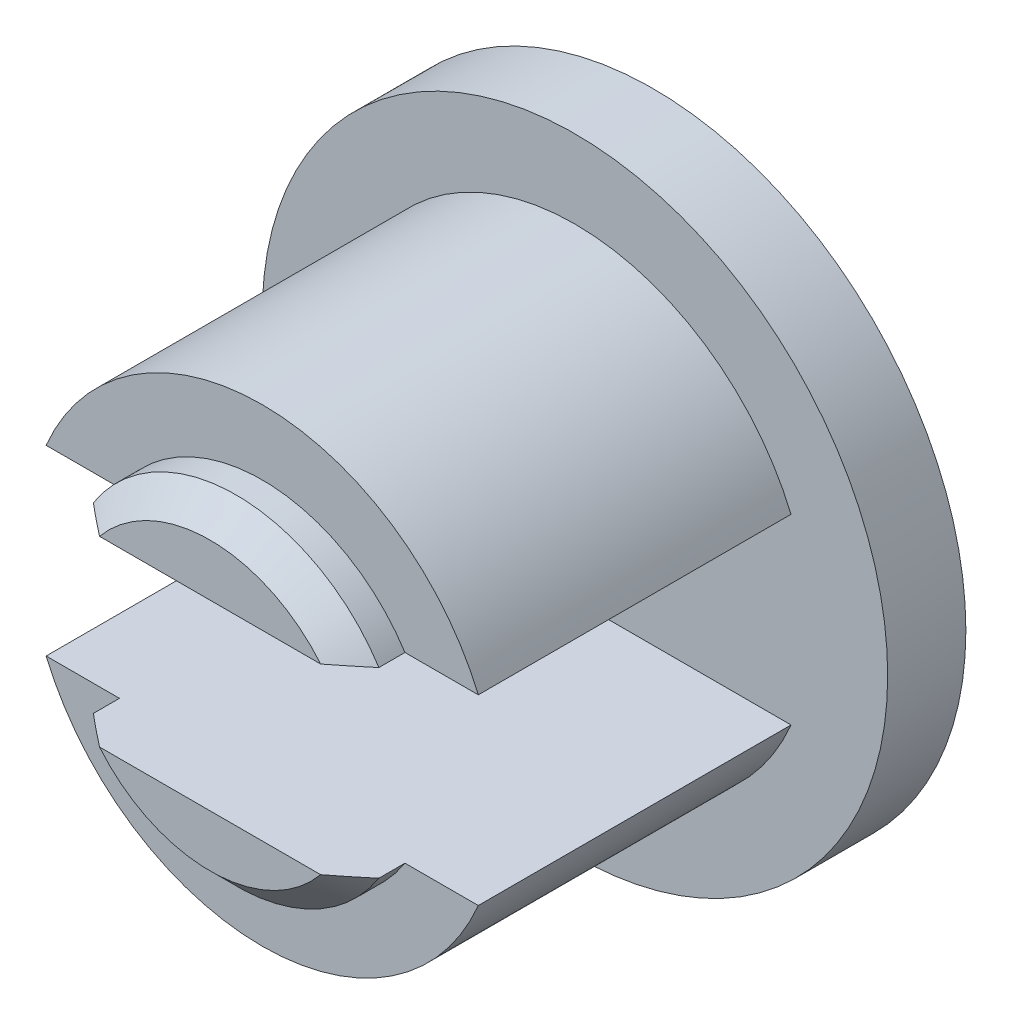
ISO-10303-21;
HEADER;
FILE_DESCRIPTION(('STEP AP214'),'2;1');
FILE_NAME('part.step','',(''),(''),'','','');
FILE_SCHEMA(('AUTOMOTIVE_DESIGN { 1 0 10303 214 1 1 1 1 }'));
ENDSEC;
DATA;
#1=APPLICATION_CONTEXT('core data for automotive mechanical design processes');
#2=APPLICATION_PROTOCOL_DEFINITION('international standard','automotive_design',2000,#1);
#3=PRODUCT_CONTEXT('',#1,'mechanical');
#4=PRODUCT('Part','Part','',(#3));
#5=PRODUCT_RELATED_PRODUCT_CATEGORY('part','',(#4));
#6=PRODUCT_DEFINITION_FORMATION('','',#4);
#7=PRODUCT_DEFINITION_CONTEXT('part definition',#1,'design');
#8=PRODUCT_DEFINITION('design','',#6,#7);
#9=PRODUCT_DEFINITION_SHAPE('','',#8);
#10=(LENGTH_UNIT() NAMED_UNIT(*) SI_UNIT(.MILLI.,.METRE.));
#11=(NAMED_UNIT(*) PLANE_ANGLE_UNIT() SI_UNIT($,.RADIAN.));
#12=(NAMED_UNIT(*) SI_UNIT($,.STERADIAN.) SOLID_ANGLE_UNIT());
#13=UNCERTAINTY_MEASURE_WITH_UNIT(LENGTH_MEASURE(1.E-05),#10,'distance_accuracy_value','');
#14=(GEOMETRIC_REPRESENTATION_CONTEXT(3) GLOBAL_UNCERTAINTY_ASSIGNED_CONTEXT((#13)) GLOBAL_UNIT_ASSIGNED_CONTEXT((#10,
#11,#12)) REPRESENTATION_CONTEXT('',''));
#15=CARTESIAN_POINT('',(0.,0.,0.));
#16=DIRECTION('',(0.,0.,1.));
#17=DIRECTION('',(1.,0.,0.));
#18=AXIS2_PLACEMENT_3D('',#15,#16,#17);
#19=CARTESIAN_POINT('',(0.,0.,9.));
#20=DIRECTION('',(0.,0.,-1.));
#21=DIRECTION('',(-1.,0.,0.));
#22=AXIS2_PLACEMENT_3D('',#19,#20,#21);
#23=CYLINDRICAL_SURFACE('',#22,4.5);
#24=CARTESIAN_POINT('',(0.,0.,9.));
#25=DIRECTION('',(0.,0.,1.));
#26=DIRECTION('',(1.,0.,0.));
#27=AXIS2_PLACEMENT_3D('',#24,#25,#26);
#28=CIRCLE('',#27,4.5);
#29=CARTESIAN_POINT('',(4.14578098794425,1.75,9.));
#30=VERTEX_POINT('',#29);
#31=CARTESIAN_POINT('',(-4.14578098794425,1.75,9.));
#32=VERTEX_POINT('',#31);
#33=EDGE_CURVE('E229',#30,#32,#28,.T.);
#34=ORIENTED_EDGE('',*,*,#33,.F.);
#35=DIRECTION('',(0.,0.,-1.));
#36=VECTOR('',#35,1.);
#37=CARTESIAN_POINT('',(4.14578098794425,1.75,9.));
#38=LINE('',#37,#36);
#39=CARTESIAN_POINT('',(4.14578098794425,1.75,3.));
#40=VERTEX_POINT('',#39);
#41=EDGE_CURVE('E78',#30,#40,#38,.T.);
#42=ORIENTED_EDGE('',*,*,#41,.T.);
#43=CARTESIAN_POINT('',(0.,0.,3.));
#44=DIRECTION('',(0.,0.,1.));
#45=DIRECTION('',(1.,0.,0.));
#46=AXIS2_PLACEMENT_3D('',#43,#44,#45);
#47=CIRCLE('',#46,4.5);
#48=CARTESIAN_POINT('',(-4.14578098794425,1.75,3.));
#49=VERTEX_POINT('',#48);
#50=EDGE_CURVE('E248',#40,#49,#47,.T.);
#51=ORIENTED_EDGE('',*,*,#50,.T.);
#52=DIRECTION('',(0.,0.,-1.));
#53=VECTOR('',#52,1.);
#54=CARTESIAN_POINT('',(-4.14578098794425,1.75,9.));
#55=LINE('',#54,#53);
#56=EDGE_CURVE('E232',#49,#32,#55,.F.);
#57=ORIENTED_EDGE('',*,*,#56,.T.);
#58=EDGE_LOOP('',(#34,#42,#51,#57));
#59=FACE_BOUND('',#58,.T.);
#60=ADVANCED_FACE('F47',(#59),#23,.T.);
#61=CARTESIAN_POINT('',(0.,0.,9.));
#62=DIRECTION('',(0.,0.,1.));
#63=DIRECTION('',(1.,0.,0.));
#64=AXIS2_PLACEMENT_3D('',#61,#62,#63);
#65=PLANE('',#64);
#66=DIRECTION('',(-1.,0.,0.));
#67=VECTOR('',#66,1.);
#68=CARTESIAN_POINT('',(0.,1.75,9.));
#69=LINE('',#68,#67);
#70=CARTESIAN_POINT('',(2.73861278752583,1.75,9.));
#71=VERTEX_POINT('',#70);
#72=EDGE_CURVE('E301',#30,#71,#69,.T.);
#73=ORIENTED_EDGE('',*,*,#72,.F.);
#74=ORIENTED_EDGE('',*,*,#33,.T.);
#75=CARTESIAN_POINT('',(-2.73861278752583,1.75,9.));
#76=VERTEX_POINT('',#75);
#77=EDGE_CURVE('E298',#76,#32,#69,.T.);
#78=ORIENTED_EDGE('',*,*,#77,.F.);
#79=CARTESIAN_POINT('',(0.,0.,9.));
#80=DIRECTION('',(0.,0.,1.));
#81=DIRECTION('',(1.,0.,0.));
#82=AXIS2_PLACEMENT_3D('',#79,#80,#81);
#83=CIRCLE('',#82,3.25);
#84=EDGE_CURVE('E246',#71,#76,#83,.T.);
#85=ORIENTED_EDGE('',*,*,#84,.F.);
#86=EDGE_LOOP('',(#73,#74,#78,#85));
#87=FACE_BOUND('',#86,.T.);
#88=ADVANCED_FACE('F186',(#87),#65,.T.);
#89=CARTESIAN_POINT('',(0.,0.,10.));
#90=DIRECTION('',(0.,0.,-1.));
#91=DIRECTION('',(-1.,0.,0.));
#92=AXIS2_PLACEMENT_3D('',#89,#90,#91);
#93=CYLINDRICAL_SURFACE('',#92,3.25);
#94=CARTESIAN_POINT('',(0.,0.,9.5));
#95=DIRECTION('',(0.,0.,1.));
#96=DIRECTION('',(1.,0.,0.));
#97=AXIS2_PLACEMENT_3D('',#94,#95,#96);
#98=CIRCLE('',#97,3.25);
#99=CARTESIAN_POINT('',(-2.73861278752583,1.75,9.5));
#100=VERTEX_POINT('',#99);
#101=CARTESIAN_POINT('',(2.73861278752583,1.75,9.5));
#102=VERTEX_POINT('',#101);
#103=EDGE_CURVE('E153',#100,#102,#98,.F.);
#104=ORIENTED_EDGE('',*,*,#103,.T.);
#105=DIRECTION('',(0.,0.,-1.));
#106=VECTOR('',#105,1.);
#107=CARTESIAN_POINT('',(2.73861278752583,1.75,10.));
#108=LINE('',#107,#106);
#109=EDGE_CURVE('E304',#102,#71,#108,.T.);
#110=ORIENTED_EDGE('',*,*,#109,.T.);
#111=ORIENTED_EDGE('',*,*,#84,.T.);
#112=DIRECTION('',(0.,0.,-1.));
#113=VECTOR('',#112,1.);
#114=CARTESIAN_POINT('',(-2.73861278752583,1.75,10.));
#115=LINE('',#114,#113);
#116=EDGE_CURVE('E292',#76,#100,#115,.F.);
#117=ORIENTED_EDGE('',*,*,#116,.T.);
#118=EDGE_LOOP('',(#104,#110,#111,#117));
#119=FACE_BOUND('',#118,.T.);
#120=ADVANCED_FACE('F181',(#119),#93,.T.);
#121=CARTESIAN_POINT('',(0.,0.,10.));
#122=DIRECTION('',(0.,0.,1.));
#123=DIRECTION('',(1.,0.,0.));
#124=AXIS2_PLACEMENT_3D('',#121,#122,#123);
#125=PLANE('',#124);
#126=DIRECTION('',(-1.,0.,0.));
#127=VECTOR('',#126,1.);
#128=CARTESIAN_POINT('',(17.72,1.75,10.));
#129=LINE('',#128,#127);
#130=CARTESIAN_POINT('',(2.12132034355964,1.75,10.));
#131=VERTEX_POINT('',#130);
#132=CARTESIAN_POINT('',(-2.12132034355964,1.75,10.));
#133=VERTEX_POINT('',#132);
#134=EDGE_CURVE('E144',#131,#133,#129,.T.);
#135=ORIENTED_EDGE('',*,*,#134,.F.);
#136=CARTESIAN_POINT('',(0.,0.,10.));
#137=DIRECTION('',(0.,0.,1.));
#138=DIRECTION('',(1.,0.,0.));
#139=AXIS2_PLACEMENT_3D('',#136,#137,#138);
#140=CIRCLE('',#139,2.75);
#141=EDGE_CURVE('E147',#131,#133,#140,.T.);
#142=ORIENTED_EDGE('',*,*,#141,.T.);
#143=EDGE_LOOP('',(#135,#142));
#144=FACE_BOUND('',#143,.T.);
#145=ADVANCED_FACE('F176',(#144),#125,.T.);
#146=CARTESIAN_POINT('',(0.,0.,10.));
#147=DIRECTION('',(0.,0.,-1.));
#148=DIRECTION('',(-1.,0.,0.));
#149=AXIS2_PLACEMENT_3D('',#146,#147,#148);
#150=CONICAL_SURFACE('',#149,2.75,0.785398163397447);
#151=CARTESIAN_POINT('',(2.73944346355251,1.75,9.49929999999991));
#152=CARTESIAN_POINT('',(2.65443009145347,1.75,9.57090762624135));
#153=CARTESIAN_POINT('',(2.56896713198327,1.75,9.64199508380564));
#154=CARTESIAN_POINT('',(2.39679009304747,1.75,9.78274815272182));
#155=CARTESIAN_POINT('',(2.31007525755715,1.75,9.85241283779644));
#156=CARTESIAN_POINT('',(2.13170023880289,1.75,9.99255703970262));
#157=CARTESIAN_POINT('',(2.03997988332316,1.75,10.0629603632436));
#158=CARTESIAN_POINT('',(1.8544659964091,1.75,10.2009429312913));
#159=CARTESIAN_POINT('',(1.76067305769593,1.75,10.2685229676268));
#160=CARTESIAN_POINT('',(1.57006002813852,1.75,10.3999366170817));
#161=CARTESIAN_POINT('',(1.47323172857247,1.75,10.4637584308617));
#162=CARTESIAN_POINT('',(1.27584645205723,1.75,10.5856875811883));
#163=CARTESIAN_POINT('',(1.17528584144719,1.75,10.6437891364416));
#164=CARTESIAN_POINT('',(0.971221072466855,1.75,10.7504234179393));
#165=CARTESIAN_POINT('',(0.867792170791659,1.75,10.799097367063));
#166=CARTESIAN_POINT('',(0.65585794408432,1.75,10.8836380088129));
#167=CARTESIAN_POINT('',(0.547366652604175,1.75,10.9195379744857));
#168=CARTESIAN_POINT('',(0.380720528488747,1.75,10.9598901970268));
#169=CARTESIAN_POINT('',(0.324199153070993,1.75,10.971115043409));
#170=CARTESIAN_POINT('',(0.210348382213359,1.75,10.9883001086163));
#171=CARTESIAN_POINT('',(0.153019082163456,1.75,10.9942609437483));
#172=CARTESIAN_POINT('',(0.0381857249401158,1.75,11.0005201961443));
#173=CARTESIAN_POINT('',(-0.019317582680136,1.75,11.0008321678665));
#174=CARTESIAN_POINT('',(-0.134077315147715,1.75,10.9958080169729));
#175=CARTESIAN_POINT('',(-0.191333719210587,1.75,10.990471427831));
#176=CARTESIAN_POINT('',(-0.304409470889937,1.75,10.9745942105262));
#177=CARTESIAN_POINT('',(-0.360237813595879,1.75,10.9641164274349));
#178=CARTESIAN_POINT('',(-0.4708234257944,1.75,10.9385702997388));
#179=CARTESIAN_POINT('',(-0.525580586499461,1.75,10.9235014914262));
#180=CARTESIAN_POINT('',(-0.634526526337474,1.75,10.8892436984579));
#181=CARTESIAN_POINT('',(-0.688699689186651,1.75,10.8700056517481));
#182=CARTESIAN_POINT('',(-0.79572337652592,1.75,10.828216891939));
#183=CARTESIAN_POINT('',(-0.848574186073777,1.75,10.8056669001182));
#184=CARTESIAN_POINT('',(-0.989127502469045,1.75,10.7413463646168));
#185=CARTESIAN_POINT('',(-1.07567632429651,1.75,10.6970619095105));
#186=CARTESIAN_POINT('',(-1.2457835950047,1.75,10.6030361685048));
#187=CARTESIAN_POINT('',(-1.3293394713507,1.75,10.5532903308824));
#188=CARTESIAN_POINT('',(-1.49434285860387,1.75,10.4496904494003));
#189=CARTESIAN_POINT('',(-1.57577983533948,1.75,10.3958197600892));
#190=CARTESIAN_POINT('',(-1.7366492577234,1.75,10.2852398487706));
#191=CARTESIAN_POINT('',(-1.81608233719687,1.75,10.2285315416611));
#192=CARTESIAN_POINT('',(-1.96756820532194,1.75,10.11724735033));
#193=CARTESIAN_POINT('',(-2.03973293491802,1.75,10.0628230909722));
#194=CARTESIAN_POINT('',(-2.18296849864286,1.75,9.95254315676739));
#195=CARTESIAN_POINT('',(-2.25403922481133,1.75,9.89668734208043));
#196=CARTESIAN_POINT('',(-2.39458600153216,1.75,9.78440241577386));
#197=CARTESIAN_POINT('',(-2.46407085462611,1.75,9.72798428977876));
#198=CARTESIAN_POINT('',(-2.60228418189618,1.75,9.61426016620873));
#199=CARTESIAN_POINT('',(-2.67101282551596,1.75,9.55695437475958));
#200=CARTESIAN_POINT('',(-2.73944346355251,1.75,9.49929999999991));
#201=B_SPLINE_CURVE_WITH_KNOTS('',3,(#151,#152,#153,#154,#155,#156,#157,#158,#159,#160,#161,
#162,#163,#164,#165,#166,#167,#168,#169,#170,#171,#172,#173,#174,#175,#176,#177,#178,#179,#180,
#181,#182,#183,#184,#185,#186,#187,#188,#189,#190,#191,#192,#193,#194,#195,#196,#197,#198,#199,
#200),.UNSPECIFIED.,.F.,.F.,(4,2,2,2,2,2,2,2,2,2,2,2,2,2,2,2,2,2,2,2,2,2,2,2,4),(0.,
0.333469080293946,0.667148753430491,1.01398632076862,1.36072595070936,1.70850177756413,
2.05662555848843,2.39904369445119,2.74056327219607,2.91322880203948,3.08587411363456,
3.25810510743988,3.43035032726062,3.60054061778064,3.77074810374958,3.94307928936489,
4.11537300002441,4.40672595280236,4.69832360049107,4.99116719519776,5.28391697280489,
5.55505528140701,5.82622017758483,6.09472718277802,6.36317274554218),.UNSPECIFIED.);
#202=EDGE_CURVE('E11',#102,#131,#201,.T.);
#203=ORIENTED_EDGE('',*,*,#202,.F.);
#204=ORIENTED_EDGE('',*,*,#103,.F.);
#205=EDGE_CURVE('E53',#133,#100,#201,.T.);
#206=ORIENTED_EDGE('',*,*,#205,.F.);
#207=ORIENTED_EDGE('',*,*,#141,.F.);
#208=EDGE_LOOP('',(#203,#204,#206,#207));
#209=FACE_BOUND('',#208,.T.);
#210=ADVANCED_FACE('F208',(#209),#150,.T.);
#211=CARTESIAN_POINT('',(0.,0.,1.5));
#212=DIRECTION('',(0.,0.,-1.));
#213=DIRECTION('',(-1.,0.,0.));
#214=AXIS2_PLACEMENT_3D('',#211,#212,#213);
#215=CYLINDRICAL_SURFACE('',#214,2.5);
#216=CARTESIAN_POINT('',(0.,0.,0.5));
#217=DIRECTION('',(0.,0.,1.));
#218=DIRECTION('',(1.,0.,0.));
#219=AXIS2_PLACEMENT_3D('',#216,#217,#218);
#220=CIRCLE('',#219,2.5);
#221=CARTESIAN_POINT('',(2.5,0.,0.5));
#222=VERTEX_POINT('',#221);
#223=EDGE_CURVE('E155',#222,#222,#220,.T.);
#224=ORIENTED_EDGE('',*,*,#223,.T.);
#225=EDGE_LOOP('',(#224));
#226=FACE_BOUND('',#225,.T.);
#227=CARTESIAN_POINT('',(0.,0.,1.5));
#228=DIRECTION('',(0.,0.,1.));
#229=DIRECTION('',(1.,0.,0.));
#230=AXIS2_PLACEMENT_3D('',#227,#228,#229);
#231=CIRCLE('',#230,2.5);
#232=CARTESIAN_POINT('',(2.5,0.,1.5));
#233=VERTEX_POINT('',#232);
#234=EDGE_CURVE('E255',#233,#233,#231,.T.);
#235=ORIENTED_EDGE('',*,*,#234,.F.);
#236=EDGE_LOOP('',(#235));
#237=FACE_BOUND('',#236,.T.);
#238=ADVANCED_FACE('F205',(#226,#237),#215,.T.);
#239=CARTESIAN_POINT('',(0.,0.,0.));
#240=DIRECTION('',(0.,0.,1.));
#241=DIRECTION('',(1.,0.,0.));
#242=AXIS2_PLACEMENT_3D('',#239,#240,#241);
#243=PLANE('',#242);
#244=CARTESIAN_POINT('',(0.,0.,0.));
#245=DIRECTION('',(0.,0.,1.));
#246=DIRECTION('',(1.,0.,0.));
#247=AXIS2_PLACEMENT_3D('',#244,#245,#246);
#248=CIRCLE('',#247,2.);
#249=CARTESIAN_POINT('',(2.,0.,0.));
#250=VERTEX_POINT('',#249);
#251=EDGE_CURVE('E148',#250,#250,#248,.F.);
#252=ORIENTED_EDGE('',*,*,#251,.T.);
#253=EDGE_LOOP('',(#252));
#254=FACE_BOUND('',#253,.T.);
#255=ADVANCED_FACE('F201',(#254),#243,.F.);
#256=CARTESIAN_POINT('',(0.,0.,3.));
#257=DIRECTION('',(0.,0.,-1.));
#258=DIRECTION('',(-1.,0.,0.));
#259=AXIS2_PLACEMENT_3D('',#256,#257,#258);
#260=CYLINDRICAL_SURFACE('',#259,6.);
#261=CARTESIAN_POINT('',(0.,0.,3.));
#262=DIRECTION('',(0.,0.,1.));
#263=DIRECTION('',(1.,0.,0.));
#264=AXIS2_PLACEMENT_3D('',#261,#262,#263);
#265=CIRCLE('',#264,6.);
#266=CARTESIAN_POINT('',(6.,0.,3.));
#267=VERTEX_POINT('',#266);
#268=EDGE_CURVE('E241',#267,#267,#265,.T.);
#269=ORIENTED_EDGE('',*,*,#268,.F.);
#270=EDGE_LOOP('',(#269));
#271=FACE_BOUND('',#270,.T.);
#272=CARTESIAN_POINT('',(0.,0.,1.5));
#273=DIRECTION('',(0.,0.,1.));
#274=DIRECTION('',(1.,0.,0.));
#275=AXIS2_PLACEMENT_3D('',#272,#273,#274);
#276=CIRCLE('',#275,6.);
#277=CARTESIAN_POINT('',(6.,0.,1.5));
#278=VERTEX_POINT('',#277);
#279=EDGE_CURVE('E235',#278,#278,#276,.T.);
#280=ORIENTED_EDGE('',*,*,#279,.T.);
#281=EDGE_LOOP('',(#280));
#282=FACE_BOUND('',#281,.T.);
#283=ADVANCED_FACE('F194',(#271,#282),#260,.T.);
#284=CARTESIAN_POINT('',(0.,0.,3.));
#285=DIRECTION('',(0.,0.,1.));
#286=DIRECTION('',(1.,0.,0.));
#287=AXIS2_PLACEMENT_3D('',#284,#285,#286);
#288=PLANE('',#287);
#289=ORIENTED_EDGE('',*,*,#50,.F.);
#290=DIRECTION('',(1.,0.,0.));
#291=VECTOR('',#290,1.);
#292=CARTESIAN_POINT('',(17.72,1.75,3.));
#293=LINE('',#292,#291);
#294=EDGE_CURVE('E320',#49,#40,#293,.T.);
#295=ORIENTED_EDGE('',*,*,#294,.F.);
#296=EDGE_LOOP('',(#289,#295));
#297=FACE_BOUND('',#296,.T.);
#298=CARTESIAN_POINT('',(-4.14578098794425,-1.75,3.));
#299=VERTEX_POINT('',#298);
#300=CARTESIAN_POINT('',(4.14578098794425,-1.75,3.));
#301=VERTEX_POINT('',#300);
#302=EDGE_CURVE('E252',#299,#301,#47,.T.);
#303=ORIENTED_EDGE('',*,*,#302,.F.);
#304=DIRECTION('',(-1.,0.,0.));
#305=VECTOR('',#304,1.);
#306=CARTESIAN_POINT('',(17.72,-1.75,3.));
#307=LINE('',#306,#305);
#308=EDGE_CURVE('E285',#301,#299,#307,.T.);
#309=ORIENTED_EDGE('',*,*,#308,.F.);
#310=EDGE_LOOP('',(#303,#309));
#311=FACE_BOUND('',#310,.T.);
#312=ORIENTED_EDGE('',*,*,#268,.T.);
#313=EDGE_LOOP('',(#312));
#314=FACE_BOUND('',#313,.T.);
#315=ADVANCED_FACE('F191',(#297,#311,#314),#288,.T.);
#316=CARTESIAN_POINT('',(0.,0.,1.5));
#317=DIRECTION('',(0.,0.,1.));
#318=DIRECTION('',(1.,0.,0.));
#319=AXIS2_PLACEMENT_3D('',#316,#317,#318);
#320=PLANE('',#319);
#321=ORIENTED_EDGE('',*,*,#234,.T.);
#322=EDGE_LOOP('',(#321));
#323=FACE_BOUND('',#322,.T.);
#324=ORIENTED_EDGE('',*,*,#279,.F.);
#325=EDGE_LOOP('',(#324));
#326=FACE_BOUND('',#325,.T.);
#327=ADVANCED_FACE('F189',(#323,#326),#320,.F.);
#328=CARTESIAN_POINT('',(-4.14578098794425,-1.75,9.));
#329=VERTEX_POINT('',#328);
#330=CARTESIAN_POINT('',(4.14578098794425,-1.75,9.));
#331=VERTEX_POINT('',#330);
#332=EDGE_CURVE('E236',#329,#331,#28,.T.);
#333=ORIENTED_EDGE('',*,*,#332,.F.);
#334=DIRECTION('',(0.,0.,-1.));
#335=VECTOR('',#334,1.);
#336=CARTESIAN_POINT('',(-4.14578098794425,-1.75,9.));
#337=LINE('',#336,#335);
#338=EDGE_CURVE('E288',#329,#299,#337,.T.);
#339=ORIENTED_EDGE('',*,*,#338,.T.);
#340=ORIENTED_EDGE('',*,*,#302,.T.);
#341=DIRECTION('',(0.,0.,-1.));
#342=VECTOR('',#341,1.);
#343=CARTESIAN_POINT('',(4.14578098794425,-1.75,9.));
#344=LINE('',#343,#342);
#345=EDGE_CURVE('E280',#301,#331,#344,.F.);
#346=ORIENTED_EDGE('',*,*,#345,.T.);
#347=EDGE_LOOP('',(#333,#339,#340,#346));
#348=FACE_BOUND('',#347,.T.);
#349=ADVANCED_FACE('F184',(#348),#23,.T.);
#350=DIRECTION('',(1.,0.,0.));
#351=VECTOR('',#350,1.);
#352=CARTESIAN_POINT('',(0.,-1.75,9.));
#353=LINE('',#352,#351);
#354=CARTESIAN_POINT('',(-2.73861278752583,-1.75,9.));
#355=VERTEX_POINT('',#354);
#356=EDGE_CURVE('E275',#329,#355,#353,.T.);
#357=ORIENTED_EDGE('',*,*,#356,.F.);
#358=ORIENTED_EDGE('',*,*,#332,.T.);
#359=CARTESIAN_POINT('',(2.73861278752583,-1.75,9.));
#360=VERTEX_POINT('',#359);
#361=EDGE_CURVE('E277',#360,#331,#353,.T.);
#362=ORIENTED_EDGE('',*,*,#361,.F.);
#363=EDGE_CURVE('E251',#355,#360,#83,.T.);
#364=ORIENTED_EDGE('',*,*,#363,.F.);
#365=EDGE_LOOP('',(#357,#358,#362,#364));
#366=FACE_BOUND('',#365,.T.);
#367=ADVANCED_FACE('F179',(#366),#65,.T.);
#368=CARTESIAN_POINT('',(2.73861278752583,-1.75,9.5));
#369=VERTEX_POINT('',#368);
#370=CARTESIAN_POINT('',(-2.73861278752583,-1.75,9.5));
#371=VERTEX_POINT('',#370);
#372=EDGE_CURVE('E159',#369,#371,#98,.F.);
#373=ORIENTED_EDGE('',*,*,#372,.T.);
#374=DIRECTION('',(0.,0.,-1.));
#375=VECTOR('',#374,1.);
#376=CARTESIAN_POINT('',(-2.73861278752583,-1.75,10.));
#377=LINE('',#376,#375);
#378=EDGE_CURVE('E132',#371,#355,#377,.T.);
#379=ORIENTED_EDGE('',*,*,#378,.T.);
#380=ORIENTED_EDGE('',*,*,#363,.T.);
#381=DIRECTION('',(0.,0.,-1.));
#382=VECTOR('',#381,1.);
#383=CARTESIAN_POINT('',(2.73861278752583,-1.75,10.));
#384=LINE('',#383,#382);
#385=EDGE_CURVE('E272',#360,#369,#384,.F.);
#386=ORIENTED_EDGE('',*,*,#385,.T.);
#387=EDGE_LOOP('',(#373,#379,#380,#386));
#388=FACE_BOUND('',#387,.T.);
#389=ADVANCED_FACE('F175',(#388),#93,.T.);
#390=DIRECTION('',(1.,0.,0.));
#391=VECTOR('',#390,1.);
#392=CARTESIAN_POINT('',(17.72,-1.75,10.));
#393=LINE('',#392,#391);
#394=CARTESIAN_POINT('',(-2.12132034355964,-1.75,10.));
#395=VERTEX_POINT('',#394);
#396=CARTESIAN_POINT('',(2.12132034355964,-1.75,10.));
#397=VERTEX_POINT('',#396);
#398=EDGE_CURVE('E70',#395,#397,#393,.T.);
#399=ORIENTED_EDGE('',*,*,#398,.F.);
#400=EDGE_CURVE('E142',#395,#397,#140,.T.);
#401=ORIENTED_EDGE('',*,*,#400,.T.);
#402=EDGE_LOOP('',(#399,#401));
#403=FACE_BOUND('',#402,.T.);
#404=ADVANCED_FACE('F141',(#403),#125,.T.);
#405=CARTESIAN_POINT('',(0.,0.,0.5));
#406=DIRECTION('',(0.,0.,1.));
#407=DIRECTION('',(1.,0.,0.));
#408=AXIS2_PLACEMENT_3D('',#405,#406,#407);
#409=CONICAL_SURFACE('',#408,2.5,0.785398163397448);
#410=ORIENTED_EDGE('',*,*,#251,.F.);
#411=EDGE_LOOP('',(#410));
#412=FACE_BOUND('',#411,.T.);
#413=ORIENTED_EDGE('',*,*,#223,.F.);
#414=EDGE_LOOP('',(#413));
#415=FACE_BOUND('',#414,.T.);
#416=ADVANCED_FACE('F174',(#412,#415),#409,.T.);
#417=CARTESIAN_POINT('',(-2.73944346355251,-1.75,9.49929999999991));
#418=CARTESIAN_POINT('',(-2.65443009145347,-1.75,9.57090762624135));
#419=CARTESIAN_POINT('',(-2.56896713198327,-1.75,9.64199508380563));
#420=CARTESIAN_POINT('',(-2.39679009304747,-1.75,9.78274815272182));
#421=CARTESIAN_POINT('',(-2.31007525755715,-1.75,9.85241283779644));
#422=CARTESIAN_POINT('',(-2.13170023880289,-1.75,9.99255703970262));
#423=CARTESIAN_POINT('',(-2.03997988332316,-1.75,10.0629603632436));
#424=CARTESIAN_POINT('',(-1.85446599640909,-1.75,10.2009429312913));
#425=CARTESIAN_POINT('',(-1.76067305769593,-1.75,10.2685229676268));
#426=CARTESIAN_POINT('',(-1.57006002813851,-1.75,10.3999366170817));
#427=CARTESIAN_POINT('',(-1.47323172857247,-1.75,10.4637584308617));
#428=CARTESIAN_POINT('',(-1.27584645205723,-1.75,10.5856875811883));
#429=CARTESIAN_POINT('',(-1.17528584144719,-1.75,10.6437891364416));
#430=CARTESIAN_POINT('',(-0.971221072466851,-1.75,10.7504234179393));
#431=CARTESIAN_POINT('',(-0.867792170791654,-1.75,10.799097367063));
#432=CARTESIAN_POINT('',(-0.655857944084315,-1.75,10.8836380088129));
#433=CARTESIAN_POINT('',(-0.54736665260417,-1.75,10.9195379744857));
#434=CARTESIAN_POINT('',(-0.380720528488741,-1.75,10.9598901970268));
#435=CARTESIAN_POINT('',(-0.324199153070988,-1.75,10.971115043409));
#436=CARTESIAN_POINT('',(-0.210348382213353,-1.75,10.9883001086163));
#437=CARTESIAN_POINT('',(-0.15301908216345,-1.75,10.9942609437483));
#438=CARTESIAN_POINT('',(-0.0381857249401098,-1.75,11.0005201961443));
#439=CARTESIAN_POINT('',(0.0193175826801422,-1.75,11.0008321678665));
#440=CARTESIAN_POINT('',(0.134077315147721,-1.75,10.9958080169729));
#441=CARTESIAN_POINT('',(0.191333719210593,-1.75,10.990471427831));
#442=CARTESIAN_POINT('',(0.304409470889943,-1.75,10.9745942105262));
#443=CARTESIAN_POINT('',(0.360237813595884,-1.75,10.9641164274349));
#444=CARTESIAN_POINT('',(0.470823425794405,-1.75,10.9385702997388));
#445=CARTESIAN_POINT('',(0.525580586499467,-1.75,10.9235014914262));
#446=CARTESIAN_POINT('',(0.634526526337479,-1.75,10.8892436984579));
#447=CARTESIAN_POINT('',(0.688699689186656,-1.75,10.8700056517481));
#448=CARTESIAN_POINT('',(0.795723376525925,-1.75,10.828216891939));
#449=CARTESIAN_POINT('',(0.848574186073782,-1.75,10.8056669001182));
#450=CARTESIAN_POINT('',(0.989127502469049,-1.75,10.7413463646168));
#451=CARTESIAN_POINT('',(1.07567632429652,-1.75,10.6970619095105));
#452=CARTESIAN_POINT('',(1.24578359500471,-1.75,10.6030361685048));
#453=CARTESIAN_POINT('',(1.32933947135071,-1.75,10.5532903308824));
#454=CARTESIAN_POINT('',(1.49434285860388,-1.75,10.4496904494003));
#455=CARTESIAN_POINT('',(1.57577983533949,-1.75,10.3958197600892));
#456=CARTESIAN_POINT('',(1.7366492577234,-1.75,10.2852398487706));
#457=CARTESIAN_POINT('',(1.81608233719687,-1.75,10.2285315416611));
#458=CARTESIAN_POINT('',(1.96756820532195,-1.75,10.11724735033));
#459=CARTESIAN_POINT('',(2.03973293491802,-1.75,10.0628230909722));
#460=CARTESIAN_POINT('',(2.18296849864287,-1.75,9.95254315676738));
#461=CARTESIAN_POINT('',(2.25403922481133,-1.75,9.89668734208043));
#462=CARTESIAN_POINT('',(2.39458600153217,-1.75,9.78440241577386));
#463=CARTESIAN_POINT('',(2.46407085462611,-1.75,9.72798428977876));
#464=CARTESIAN_POINT('',(2.60228418189618,-1.75,9.61426016620873));
#465=CARTESIAN_POINT('',(2.67101282551596,-1.75,9.55695437475958));
#466=CARTESIAN_POINT('',(2.73944346355251,-1.75,9.49929999999991));
#467=B_SPLINE_CURVE_WITH_KNOTS('',3,(#417,#418,#419,#420,#421,#422,#423,#424,#425,#426,#427,
#428,#429,#430,#431,#432,#433,#434,#435,#436,#437,#438,#439,#440,#441,#442,#443,#444,#445,#446,
#447,#448,#449,#450,#451,#452,#453,#454,#455,#456,#457,#458,#459,#460,#461,#462,#463,#464,#465,
#466),.UNSPECIFIED.,.F.,.F.,(4,2,2,2,2,2,2,2,2,2,2,2,2,2,2,2,2,2,2,2,2,2,2,2,4),(0.,
0.333469080293948,0.667148753430493,1.01398632076862,1.36072595070937,1.70850177756413,
2.05662555848843,2.3990436944512,2.74056327219607,2.91322880203948,3.08587411363456,
3.25810510743989,3.43035032726062,3.60054061778064,3.77074810374959,3.94307928936489,
4.11537300002442,4.40672595280236,4.69832360049107,4.99116719519776,5.28391697280489,
5.55505528140702,5.82622017758483,6.09472718277802,6.36317274554218),.UNSPECIFIED.);
#468=EDGE_CURVE('E129',#371,#395,#467,.T.);
#469=ORIENTED_EDGE('',*,*,#468,.F.);
#470=ORIENTED_EDGE('',*,*,#372,.F.);
#471=EDGE_CURVE('E138',#397,#369,#467,.T.);
#472=ORIENTED_EDGE('',*,*,#471,.F.);
#473=ORIENTED_EDGE('',*,*,#400,.F.);
#474=EDGE_LOOP('',(#469,#470,#472,#473));
#475=FACE_BOUND('',#474,.T.);
#476=ADVANCED_FACE('F50',(#475),#150,.T.);
#477=CARTESIAN_POINT('',(17.72,1.75,-32.612407950039));
#478=DIRECTION('',(0.,1.,0.));
#479=DIRECTION('',(-1.,0.,0.));
#480=AXIS2_PLACEMENT_3D('',#477,#478,#479);
#481=PLANE('',#480);
#482=ORIENTED_EDGE('',*,*,#72,.T.);
#483=ORIENTED_EDGE('',*,*,#109,.F.);
#484=ORIENTED_EDGE('',*,*,#202,.T.);
#485=ORIENTED_EDGE('',*,*,#134,.T.);
#486=ORIENTED_EDGE('',*,*,#205,.T.);
#487=ORIENTED_EDGE('',*,*,#116,.F.);
#488=ORIENTED_EDGE('',*,*,#77,.T.);
#489=ORIENTED_EDGE('',*,*,#56,.F.);
#490=ORIENTED_EDGE('',*,*,#294,.T.);
#491=ORIENTED_EDGE('',*,*,#41,.F.);
#492=EDGE_LOOP('',(#482,#483,#484,#485,#486,#487,#488,#489,#490,#491));
#493=FACE_BOUND('',#492,.T.);
#494=ADVANCED_FACE('F170',(#493),#481,.F.);
#495=CARTESIAN_POINT('',(17.72,-1.75,-32.612407950039));
#496=DIRECTION('',(0.,-1.,0.));
#497=DIRECTION('',(1.,0.,0.));
#498=AXIS2_PLACEMENT_3D('',#495,#496,#497);
#499=PLANE('',#498);
#500=ORIENTED_EDGE('',*,*,#356,.T.);
#501=ORIENTED_EDGE('',*,*,#378,.F.);
#502=ORIENTED_EDGE('',*,*,#468,.T.);
#503=ORIENTED_EDGE('',*,*,#398,.T.);
#504=ORIENTED_EDGE('',*,*,#471,.T.);
#505=ORIENTED_EDGE('',*,*,#385,.F.);
#506=ORIENTED_EDGE('',*,*,#361,.T.);
#507=ORIENTED_EDGE('',*,*,#345,.F.);
#508=ORIENTED_EDGE('',*,*,#308,.T.);
#509=ORIENTED_EDGE('',*,*,#338,.F.);
#510=EDGE_LOOP('',(#500,#501,#502,#503,#504,#505,#506,#507,#508,#509));
#511=FACE_BOUND('',#510,.T.);
#512=ADVANCED_FACE('F130',(#511),#499,.F.);
#513=CLOSED_SHELL('',(#60,#88,#120,#145,#210,#238,#255,#283,#315,#327,#349,#367,#389,#404,#416,
#476,#494,#512));
#514=MANIFOLD_SOLID_BREP('B2',#513);
#515=ADVANCED_BREP_SHAPE_REPRESENTATION('',(#18,#514),#14);
#516=SHAPE_DEFINITION_REPRESENTATION(#9,#515);
ENDSEC;
END-ISO-10303-21;
